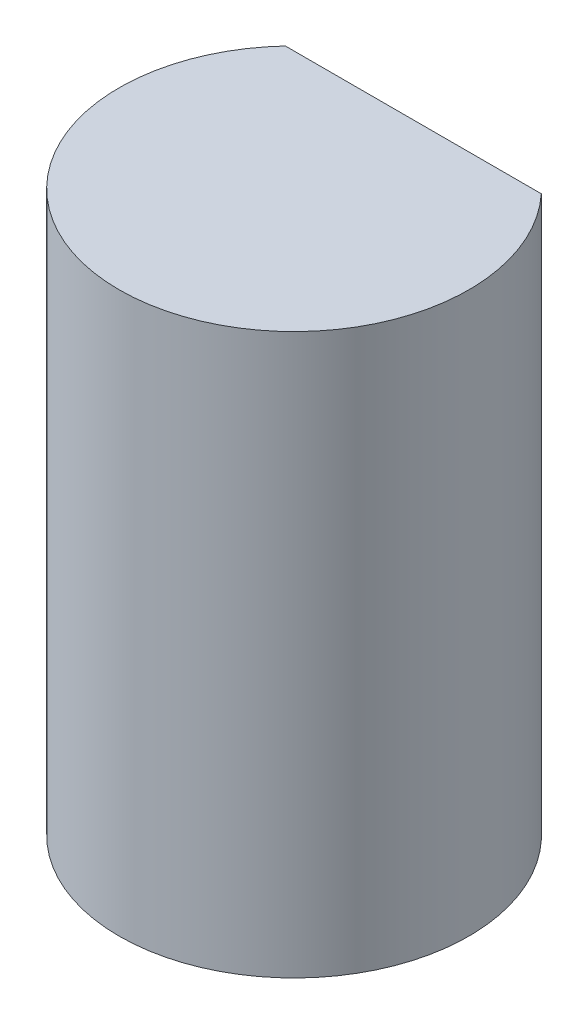
ISO-10303-21;
HEADER;
FILE_DESCRIPTION(('STEP AP214'),'2;1');
FILE_NAME('part.step','',(''),(''),'','','');
FILE_SCHEMA(('AUTOMOTIVE_DESIGN { 1 0 10303 214 1 1 1 1 }'));
ENDSEC;
DATA;
#1=APPLICATION_CONTEXT('core data for automotive mechanical design processes');
#2=APPLICATION_PROTOCOL_DEFINITION('international standard','automotive_design',2000,#1);
#3=PRODUCT_CONTEXT('',#1,'mechanical');
#4=PRODUCT('Part','Part','',(#3));
#5=PRODUCT_RELATED_PRODUCT_CATEGORY('part','',(#4));
#6=PRODUCT_DEFINITION_FORMATION('','',#4);
#7=PRODUCT_DEFINITION_CONTEXT('part definition',#1,'design');
#8=PRODUCT_DEFINITION('design','',#6,#7);
#9=PRODUCT_DEFINITION_SHAPE('','',#8);
#10=(LENGTH_UNIT() NAMED_UNIT(*) SI_UNIT(.MILLI.,.METRE.));
#11=(NAMED_UNIT(*) PLANE_ANGLE_UNIT() SI_UNIT($,.RADIAN.));
#12=(NAMED_UNIT(*) SI_UNIT($,.STERADIAN.) SOLID_ANGLE_UNIT());
#13=UNCERTAINTY_MEASURE_WITH_UNIT(LENGTH_MEASURE(1.E-05),#10,'distance_accuracy_value','');
#14=(GEOMETRIC_REPRESENTATION_CONTEXT(3) GLOBAL_UNCERTAINTY_ASSIGNED_CONTEXT((#13)) GLOBAL_UNIT_ASSIGNED_CONTEXT((#10,
#11,#12)) REPRESENTATION_CONTEXT('',''));
#15=CARTESIAN_POINT('',(0.,0.,0.));
#16=DIRECTION('',(0.,0.,1.));
#17=DIRECTION('',(1.,0.,0.));
#18=AXIS2_PLACEMENT_3D('',#15,#16,#17);
#19=CARTESIAN_POINT('',(0.,6.35,0.));
#20=DIRECTION('',(0.,-1.,0.));
#21=DIRECTION('',(0.,0.,-1.));
#22=AXIS2_PLACEMENT_3D('',#19,#20,#21);
#23=CYLINDRICAL_SURFACE('',#22,3.96875);
#24=CARTESIAN_POINT('',(0.,6.35,0.));
#25=DIRECTION('',(0.,1.,0.));
#26=DIRECTION('',(0.,0.,1.));
#27=AXIS2_PLACEMENT_3D('',#24,#25,#26);
#28=CIRCLE('',#27,3.96875);
#29=CARTESIAN_POINT('',(-2.90295091560984,6.35,-2.70626172866927));
#30=VERTEX_POINT('',#29);
#31=CARTESIAN_POINT('',(2.90295091560984,6.35,-2.70626172866927));
#32=VERTEX_POINT('',#31);
#33=EDGE_CURVE('E11',#30,#32,#28,.T.);
#34=ORIENTED_EDGE('',*,*,#33,.F.);
#35=DIRECTION('',(0.,1.,0.));
#36=VECTOR('',#35,1.);
#37=CARTESIAN_POINT('',(-2.90295091560984,-6.351,-2.70626172866927));
#38=LINE('',#37,#36);
#39=CARTESIAN_POINT('',(-2.90295091560984,-6.35,-2.70626172866927));
#40=VERTEX_POINT('',#39);
#41=EDGE_CURVE('E65',#40,#30,#38,.T.);
#42=ORIENTED_EDGE('',*,*,#41,.F.);
#43=CARTESIAN_POINT('',(0.,-6.35,0.));
#44=DIRECTION('',(0.,1.,0.));
#45=DIRECTION('',(0.,0.,1.));
#46=AXIS2_PLACEMENT_3D('',#43,#44,#45);
#47=CIRCLE('',#46,3.96875);
#48=CARTESIAN_POINT('',(2.90295091560984,-6.35,-2.70626172866927));
#49=VERTEX_POINT('',#48);
#50=EDGE_CURVE('E41',#40,#49,#47,.T.);
#51=ORIENTED_EDGE('',*,*,#50,.T.);
#52=DIRECTION('',(0.,1.,0.));
#53=VECTOR('',#52,1.);
#54=CARTESIAN_POINT('',(2.90295091560984,-6.351,-2.70626172866927));
#55=LINE('',#54,#53);
#56=EDGE_CURVE('E53',#49,#32,#55,.T.);
#57=ORIENTED_EDGE('',*,*,#56,.T.);
#58=EDGE_LOOP('',(#34,#42,#51,#57));
#59=FACE_BOUND('',#58,.T.);
#60=ADVANCED_FACE('F38',(#59),#23,.T.);
#61=CARTESIAN_POINT('',(0.,6.35,0.));
#62=DIRECTION('',(0.,1.,0.));
#63=DIRECTION('',(0.,0.,1.));
#64=AXIS2_PLACEMENT_3D('',#61,#62,#63);
#65=PLANE('',#64);
#66=DIRECTION('',(1.,0.,0.));
#67=VECTOR('',#66,1.);
#68=CARTESIAN_POINT('',(-2.90295091560984,6.35,-2.70626172866927));
#69=LINE('',#68,#67);
#70=EDGE_CURVE('E58',#30,#32,#69,.T.);
#71=ORIENTED_EDGE('',*,*,#70,.F.);
#72=ORIENTED_EDGE('',*,*,#33,.T.);
#73=EDGE_LOOP('',(#71,#72));
#74=FACE_BOUND('',#73,.T.);
#75=ADVANCED_FACE('F82',(#74),#65,.T.);
#76=CARTESIAN_POINT('',(0.,-6.35,0.));
#77=DIRECTION('',(0.,1.,0.));
#78=DIRECTION('',(0.,0.,1.));
#79=AXIS2_PLACEMENT_3D('',#76,#77,#78);
#80=PLANE('',#79);
#81=ORIENTED_EDGE('',*,*,#50,.F.);
#82=DIRECTION('',(-1.,0.,0.));
#83=VECTOR('',#82,1.);
#84=CARTESIAN_POINT('',(-2.90295091560984,-6.35,-2.70626172866927));
#85=LINE('',#84,#83);
#86=EDGE_CURVE('E62',#49,#40,#85,.T.);
#87=ORIENTED_EDGE('',*,*,#86,.F.);
#88=EDGE_LOOP('',(#81,#87));
#89=FACE_BOUND('',#88,.T.);
#90=ADVANCED_FACE('F75',(#89),#80,.F.);
#91=CARTESIAN_POINT('',(-2.90295091560984,-6.351,-2.70626172866927));
#92=DIRECTION('',(0.,0.,1.));
#93=DIRECTION('',(1.,0.,0.));
#94=AXIS2_PLACEMENT_3D('',#91,#92,#93);
#95=PLANE('',#94);
#96=ORIENTED_EDGE('',*,*,#86,.T.);
#97=ORIENTED_EDGE('',*,*,#41,.T.);
#98=ORIENTED_EDGE('',*,*,#70,.T.);
#99=ORIENTED_EDGE('',*,*,#56,.F.);
#100=EDGE_LOOP('',(#96,#97,#98,#99));
#101=FACE_BOUND('',#100,.T.);
#102=ADVANCED_FACE('F64',(#101),#95,.F.);
#103=CLOSED_SHELL('',(#60,#75,#90,#102));
#104=MANIFOLD_SOLID_BREP('B2',#103);
#105=ADVANCED_BREP_SHAPE_REPRESENTATION('',(#18,#104),#14);
#106=SHAPE_DEFINITION_REPRESENTATION(#9,#105);
ENDSEC;
END-ISO-10303-21;
